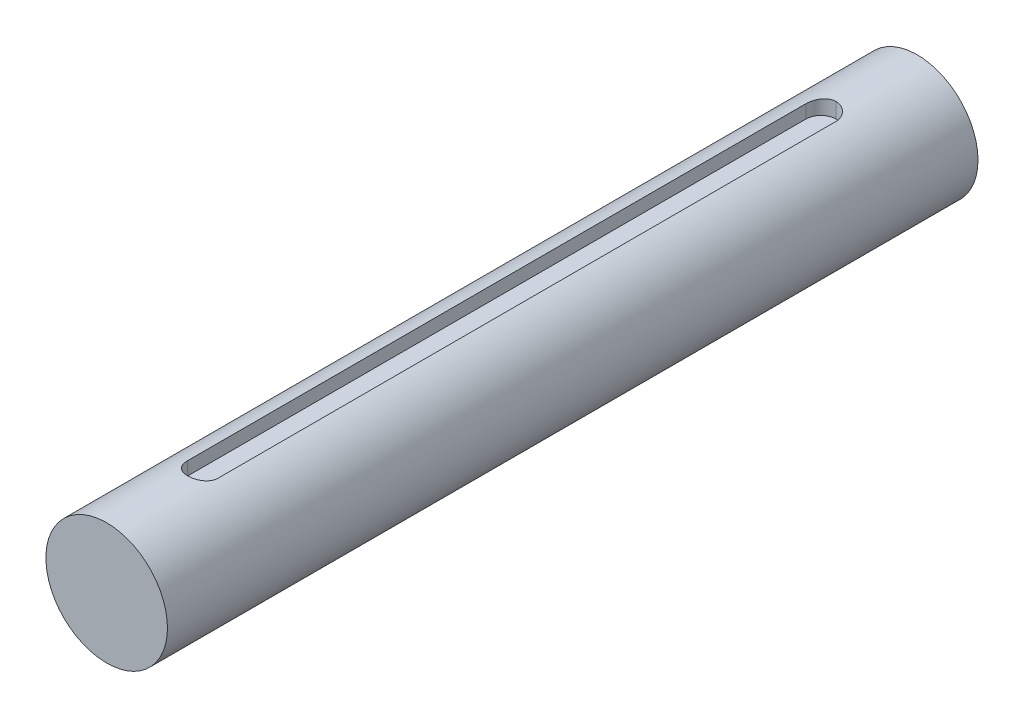
ISO-10303-21;
HEADER;
FILE_DESCRIPTION(('STEP AP214'),'2;1');
FILE_NAME('part.step','',(''),(''),'','','');
FILE_SCHEMA(('AUTOMOTIVE_DESIGN { 1 0 10303 214 1 1 1 1 }'));
ENDSEC;
DATA;
#1=APPLICATION_CONTEXT('core data for automotive mechanical design processes');
#2=APPLICATION_PROTOCOL_DEFINITION('international standard','automotive_design',2000,#1);
#3=PRODUCT_CONTEXT('',#1,'mechanical');
#4=PRODUCT('Part','Part','',(#3));
#5=PRODUCT_RELATED_PRODUCT_CATEGORY('part','',(#4));
#6=PRODUCT_DEFINITION_FORMATION('','',#4);
#7=PRODUCT_DEFINITION_CONTEXT('part definition',#1,'design');
#8=PRODUCT_DEFINITION('design','',#6,#7);
#9=PRODUCT_DEFINITION_SHAPE('','',#8);
#10=(LENGTH_UNIT() NAMED_UNIT(*) SI_UNIT(.MILLI.,.METRE.));
#11=(NAMED_UNIT(*) PLANE_ANGLE_UNIT() SI_UNIT($,.RADIAN.));
#12=(NAMED_UNIT(*) SI_UNIT($,.STERADIAN.) SOLID_ANGLE_UNIT());
#13=UNCERTAINTY_MEASURE_WITH_UNIT(LENGTH_MEASURE(1.E-05),#10,'distance_accuracy_value','');
#14=(GEOMETRIC_REPRESENTATION_CONTEXT(3) GLOBAL_UNCERTAINTY_ASSIGNED_CONTEXT((#13)) GLOBAL_UNIT_ASSIGNED_CONTEXT((#10,
#11,#12)) REPRESENTATION_CONTEXT('',''));
#15=CARTESIAN_POINT('',(0.,0.,0.));
#16=DIRECTION('',(0.,0.,1.));
#17=DIRECTION('',(1.,0.,0.));
#18=AXIS2_PLACEMENT_3D('',#15,#16,#17);
#19=CARTESIAN_POINT('',(2.38125,7.14375,-6.73519209080187));
#20=DIRECTION('',(1.,0.,0.));
#21=DIRECTION('',(0.,1.,0.));
#22=AXIS2_PLACEMENT_3D('',#19,#20,#21);
#23=PLANE('',#22);
#24=DIRECTION('',(0.,0.,1.));
#25=VECTOR('',#24,1.);
#26=CARTESIAN_POINT('',(2.38125,7.14375,-6.73519209080187));
#27=LINE('',#26,#25);
#28=CARTESIAN_POINT('',(2.38125,7.14375,15.08125));
#29=VERTEX_POINT('',#28);
#30=CARTESIAN_POINT('',(2.38125,7.14375,111.91875));
#31=VERTEX_POINT('',#30);
#32=EDGE_CURVE('E167',#29,#31,#27,.T.);
#33=ORIENTED_EDGE('',*,*,#32,.T.);
#34=DIRECTION('',(0.,1.,0.));
#35=VECTOR('',#34,1.);
#36=CARTESIAN_POINT('',(2.38125,9.22254159315641,111.91875));
#37=LINE('',#36,#35);
#38=CARTESIAN_POINT('',(2.38125,9.22254159315641,111.91875));
#39=VERTEX_POINT('',#38);
#40=EDGE_CURVE('E99',#31,#39,#37,.T.);
#41=ORIENTED_EDGE('',*,*,#40,.T.);
#42=DIRECTION('',(0.,0.,-1.));
#43=VECTOR('',#42,1.);
#44=CARTESIAN_POINT('',(2.38125,9.22254159315641,127.));
#45=LINE('',#44,#43);
#46=CARTESIAN_POINT('',(2.38125,9.22254159315641,15.08125));
#47=VERTEX_POINT('',#46);
#48=EDGE_CURVE('E88',#47,#39,#45,.F.);
#49=ORIENTED_EDGE('',*,*,#48,.F.);
#50=DIRECTION('',(0.,-1.,0.));
#51=VECTOR('',#50,1.);
#52=CARTESIAN_POINT('',(2.38125,7.14375,15.08125));
#53=LINE('',#52,#51);
#54=EDGE_CURVE('E96',#47,#29,#53,.T.);
#55=ORIENTED_EDGE('',*,*,#54,.T.);
#56=EDGE_LOOP('',(#33,#41,#49,#55));
#57=FACE_BOUND('',#56,.T.);
#58=ADVANCED_FACE('F35',(#57),#23,.F.);
#59=CARTESIAN_POINT('',(-2.38125,7.14375,-6.73519209080187));
#60=DIRECTION('',(-1.,0.,0.));
#61=DIRECTION('',(0.,0.,1.));
#62=AXIS2_PLACEMENT_3D('',#59,#60,#61);
#63=PLANE('',#62);
#64=DIRECTION('',(0.,0.,-1.));
#65=VECTOR('',#64,1.);
#66=CARTESIAN_POINT('',(-2.38125,9.22254159315641,127.));
#67=LINE('',#66,#65);
#68=CARTESIAN_POINT('',(-2.38125,9.22254159315641,111.91875));
#69=VERTEX_POINT('',#68);
#70=CARTESIAN_POINT('',(-2.38125,9.22254159315641,15.08125));
#71=VERTEX_POINT('',#70);
#72=EDGE_CURVE('E101',#69,#71,#67,.T.);
#73=ORIENTED_EDGE('',*,*,#72,.F.);
#74=DIRECTION('',(0.,-1.,0.));
#75=VECTOR('',#74,1.);
#76=CARTESIAN_POINT('',(-2.38125,7.14375,111.91875));
#77=LINE('',#76,#75);
#78=CARTESIAN_POINT('',(-2.38125,7.14375,111.91875));
#79=VERTEX_POINT('',#78);
#80=EDGE_CURVE('E122',#69,#79,#77,.T.);
#81=ORIENTED_EDGE('',*,*,#80,.T.);
#82=DIRECTION('',(0.,0.,1.));
#83=VECTOR('',#82,1.);
#84=CARTESIAN_POINT('',(-2.38125,7.14375,-6.73519209080187));
#85=LINE('',#84,#83);
#86=CARTESIAN_POINT('',(-2.38125,7.14375,15.08125));
#87=VERTEX_POINT('',#86);
#88=EDGE_CURVE('E163',#87,#79,#85,.T.);
#89=ORIENTED_EDGE('',*,*,#88,.F.);
#90=DIRECTION('',(0.,1.,0.));
#91=VECTOR('',#90,1.);
#92=CARTESIAN_POINT('',(-2.38125,7.14375,15.08125));
#93=LINE('',#92,#91);
#94=EDGE_CURVE('E119',#87,#71,#93,.T.);
#95=ORIENTED_EDGE('',*,*,#94,.T.);
#96=EDGE_LOOP('',(#73,#81,#89,#95));
#97=FACE_BOUND('',#96,.T.);
#98=ADVANCED_FACE('F177',(#97),#63,.F.);
#99=CARTESIAN_POINT('',(2.38125,7.14375,-6.73519209080187));
#100=DIRECTION('',(0.,-1.,0.));
#101=DIRECTION('',(0.,0.,-1.));
#102=AXIS2_PLACEMENT_3D('',#99,#100,#101);
#103=PLANE('',#102);
#104=CARTESIAN_POINT('',(0.,7.14375,111.91875));
#105=DIRECTION('',(0.,-1.,0.));
#106=DIRECTION('',(0.,0.,-1.));
#107=AXIS2_PLACEMENT_3D('',#104,#105,#106);
#108=CIRCLE('',#107,2.38125);
#109=CARTESIAN_POINT('',(0.,7.14375,114.3));
#110=VERTEX_POINT('',#109);
#111=EDGE_CURVE('E115',#79,#110,#108,.F.);
#112=ORIENTED_EDGE('',*,*,#111,.T.);
#113=CARTESIAN_POINT('',(0.,7.14375,111.91875));
#114=DIRECTION('',(0.,-1.,0.));
#115=DIRECTION('',(0.,0.,-1.));
#116=AXIS2_PLACEMENT_3D('',#113,#114,#115);
#117=CIRCLE('',#116,2.38125);
#118=EDGE_CURVE('E117',#110,#31,#117,.F.);
#119=ORIENTED_EDGE('',*,*,#118,.T.);
#120=ORIENTED_EDGE('',*,*,#32,.F.);
#121=CARTESIAN_POINT('',(0.,7.14375,15.08125));
#122=DIRECTION('',(0.,-1.,0.));
#123=DIRECTION('',(0.,0.,-1.));
#124=AXIS2_PLACEMENT_3D('',#121,#122,#123);
#125=CIRCLE('',#124,2.38125);
#126=CARTESIAN_POINT('',(0.,7.14375,12.7));
#127=VERTEX_POINT('',#126);
#128=EDGE_CURVE('E104',#29,#127,#125,.F.);
#129=ORIENTED_EDGE('',*,*,#128,.T.);
#130=CARTESIAN_POINT('',(0.,7.14375,15.08125));
#131=DIRECTION('',(0.,-1.,0.));
#132=DIRECTION('',(0.,0.,-1.));
#133=AXIS2_PLACEMENT_3D('',#130,#131,#132);
#134=CIRCLE('',#133,2.38125);
#135=EDGE_CURVE('E113',#127,#87,#134,.F.);
#136=ORIENTED_EDGE('',*,*,#135,.T.);
#137=ORIENTED_EDGE('',*,*,#88,.T.);
#138=EDGE_LOOP('',(#112,#119,#120,#129,#136,#137));
#139=FACE_BOUND('',#138,.T.);
#140=ADVANCED_FACE('F173',(#139),#103,.F.);
#141=CARTESIAN_POINT('',(0.,0.,127.));
#142=DIRECTION('',(0.,0.,-1.));
#143=DIRECTION('',(-1.,0.,0.));
#144=AXIS2_PLACEMENT_3D('',#141,#142,#143);
#145=CYLINDRICAL_SURFACE('',#144,9.525);
#146=CARTESIAN_POINT('',(0.,0.,127.));
#147=DIRECTION('',(0.,0.,1.));
#148=DIRECTION('',(1.,0.,0.));
#149=AXIS2_PLACEMENT_3D('',#146,#147,#148);
#150=CIRCLE('',#149,9.525);
#151=CARTESIAN_POINT('',(9.525,0.,127.));
#152=VERTEX_POINT('',#151);
#153=EDGE_CURVE('E105',#152,#152,#150,.T.);
#154=ORIENTED_EDGE('',*,*,#153,.F.);
#155=EDGE_LOOP('',(#154));
#156=FACE_BOUND('',#155,.T.);
#157=CARTESIAN_POINT('',(-2.38125,9.22254159315641,15.08125));
#158=CARTESIAN_POINT('',(-2.38125763074315,9.2225342345223,15.0153941373318));
#159=CARTESIAN_POINT('',(-2.37851815039527,9.22324681871764,14.9495427981308));
#160=CARTESIAN_POINT('',(-2.36760423136629,9.22605729674806,14.8183325820172));
#161=CARTESIAN_POINT('',(-2.35943070784727,9.22815495731823,14.7529736240556));
#162=CARTESIAN_POINT('',(-2.33773008394276,9.23367541031934,14.6233414348254));
#163=CARTESIAN_POINT('',(-2.32421393750892,9.23709549108838,14.559066260879));
#164=CARTESIAN_POINT('',(-2.29195356993802,9.24515268237875,14.4319373484491));
#165=CARTESIAN_POINT('',(-2.27320927722138,9.24978980956285,14.3690836294398));
#166=CARTESIAN_POINT('',(-2.20933915791582,9.26533281821018,14.1833205016729));
#167=CARTESIAN_POINT('',(-2.15655447290944,9.27787617792557,14.0630811637011));
#168=CARTESIAN_POINT('',(-2.0321922630698,9.30590440531809,13.8331869303088));
#169=CARTESIAN_POINT('',(-1.96060913855792,9.32139014909186,13.7235352020587));
#170=CARTESIAN_POINT('',(-1.799000281036,9.35393686274582,13.5154823899377));
#171=CARTESIAN_POINT('',(-1.70863959287883,9.37102281865316,13.417344917124));
#172=CARTESIAN_POINT('',(-1.51275234442794,9.40462987301472,13.2374435442794));
#173=CARTESIAN_POINT('',(-1.40722291298823,9.4211508637976,13.1556827510615));
#174=CARTESIAN_POINT('',(-1.18215868988682,9.45204719798276,13.0097542326671));
#175=CARTESIAN_POINT('',(-1.06244605103549,9.46638868248797,12.9458532677694));
#176=CARTESIAN_POINT('',(-0.813591534287606,9.49101048295816,12.8392172043035));
#177=CARTESIAN_POINT('',(-0.68445703328339,9.50129393659317,12.7964657464203));
#178=CARTESIAN_POINT('',(-0.462196310122587,9.51421049974997,12.7434371338685));
#179=CARTESIAN_POINT('',(-0.370534702416561,9.51823293284857,12.7271733394671));
#180=CARTESIAN_POINT('',(-0.18593156334214,9.5236379090544,12.7054480661359));
#181=CARTESIAN_POINT('',(-0.0929909916165587,9.52502233321601,12.6999788899133));
#182=CARTESIAN_POINT('',(0.,9.525,12.7));
#183=B_SPLINE_CURVE_WITH_KNOTS('',3,(#157,#158,#159,#160,#161,#162,#163,#164,#165,#166,#167,
#168,#169,#170,#171,#172,#173,#174,#175,#176,#177,#178,#179,#180,#181,#182),.UNSPECIFIED.,.F.,
.F.,(4,2,2,2,2,2,2,2,2,2,2,2,4),(0.,0.197498977317389,0.39496470171429,0.592027645889478,
0.789093288224276,1.18283976290481,1.57670366007859,1.97831196633882,2.37999638953134,
2.78739385686708,3.19447570431235,3.47338198780488,3.75208932030345),.UNSPECIFIED.);
#184=CARTESIAN_POINT('',(0.,9.525,12.7));
#185=VERTEX_POINT('',#184);
#186=EDGE_CURVE('E45',#71,#185,#183,.T.);
#187=ORIENTED_EDGE('',*,*,#186,.T.);
#188=CARTESIAN_POINT('',(0.,9.525,12.7));
#189=CARTESIAN_POINT('',(0.0658884199425099,9.52500650508056,12.6999924463347));
#190=CARTESIAN_POINT('',(0.131772499224708,9.52431647943195,12.7027345588879));
#191=CARTESIAN_POINT('',(0.263050053634154,9.52159161553763,12.7136595210218));
#192=CARTESIAN_POINT('',(0.328443603516503,9.51955698659647,12.7218415238158));
#193=CARTESIAN_POINT('',(0.458151537588408,9.51419640393246,12.7435663597325));
#194=CARTESIAN_POINT('',(0.522467788280683,9.5108729930561,12.7570986374533));
#195=CARTESIAN_POINT('',(0.649679412061081,9.50303168065627,12.7893990671768));
#196=CARTESIAN_POINT('',(0.712574770148888,9.49851376652885,12.8081672744271));
#197=CARTESIAN_POINT('',(0.898469050420059,9.48334152761523,12.8721241313657));
#198=CARTESIAN_POINT('',(1.0187965632787,9.47106339841349,12.9249853610688));
#199=CARTESIAN_POINT('',(1.24883708761313,9.44349019541688,13.049526590647));
#200=CARTESIAN_POINT('',(1.35854731920021,9.42819433466735,13.1212115009202));
#201=CARTESIAN_POINT('',(1.56653682572832,9.39589625275311,13.2829252502496));
#202=CARTESIAN_POINT('',(1.66456989745674,9.37886790715589,13.3732660573224));
#203=CARTESIAN_POINT('',(1.8442691545157,9.34519544835465,13.5690701642817));
#204=CARTESIAN_POINT('',(1.92593171538301,9.32855142095956,13.6745368042102));
#205=CARTESIAN_POINT('',(2.07175262604621,9.29726457998935,13.8995408540167));
#206=CARTESIAN_POINT('',(2.13562741704491,9.28265585815681,14.0192670257863));
#207=CARTESIAN_POINT('',(2.24221020364855,9.25749078996855,14.2681478929191));
#208=CARTESIAN_POINT('',(2.28493531333068,9.24693116869228,14.3972948676551));
#209=CARTESIAN_POINT('',(2.337893990042,9.23365452084293,14.6194840650112));
#210=CARTESIAN_POINT('',(2.35412654241721,9.22951409846927,14.7110556737323));
#211=CARTESIAN_POINT('',(2.37581166434526,9.22394586655219,14.8954849894754));
#212=CARTESIAN_POINT('',(2.38127128948668,9.22251628160498,14.988341814599));
#213=CARTESIAN_POINT('',(2.38125,9.22254159315641,15.08125));
#214=B_SPLINE_CURVE_WITH_KNOTS('',3,(#188,#189,#190,#191,#192,#193,#194,#195,#196,#197,#198,
#199,#200,#201,#202,#203,#204,#205,#206,#207,#208,#209,#210,#211,#212,#213),.UNSPECIFIED.,.F.,
.F.,(4,2,2,2,2,2,2,2,2,2,2,2,4),(0.,0.197597099193096,0.395163447134122,0.592341951689063,
0.789522536879094,1.18352169855585,1.57762374224359,1.97894489045528,2.38035479406148,
2.78783855486565,3.19499204331976,3.47363174513846,3.75208889485639),.UNSPECIFIED.);
#215=EDGE_CURVE('E12',#185,#47,#214,.T.);
#216=ORIENTED_EDGE('',*,*,#215,.T.);
#217=ORIENTED_EDGE('',*,*,#48,.T.);
#218=CARTESIAN_POINT('',(2.38125,9.22254159315641,111.91875));
#219=CARTESIAN_POINT('',(2.38125763074315,9.2225342345223,111.984605862668));
#220=CARTESIAN_POINT('',(2.37851815039527,9.22324681871764,112.050457201869));
#221=CARTESIAN_POINT('',(2.36760423136629,9.22605729674806,112.181667417983));
#222=CARTESIAN_POINT('',(2.35943070784727,9.22815495731823,112.247026375944));
#223=CARTESIAN_POINT('',(2.33773008394276,9.23367541031934,112.376658565175));
#224=CARTESIAN_POINT('',(2.32421393750892,9.23709549108838,112.440933739121));
#225=CARTESIAN_POINT('',(2.29195356993802,9.24515268237875,112.568062651551));
#226=CARTESIAN_POINT('',(2.27320927722138,9.24978980956285,112.63091637056));
#227=CARTESIAN_POINT('',(2.20933915791583,9.26533281821017,112.816679498327));
#228=CARTESIAN_POINT('',(2.15655447290944,9.27787617792557,112.936918836299));
#229=CARTESIAN_POINT('',(2.0321922630698,9.30590440531809,113.166813069691));
#230=CARTESIAN_POINT('',(1.96060913855793,9.32139014909185,113.276464797941));
#231=CARTESIAN_POINT('',(1.799000281036,9.35393686274582,113.484517610062));
#232=CARTESIAN_POINT('',(1.70863959287883,9.37102281865316,113.582655082876));
#233=CARTESIAN_POINT('',(1.51275234442795,9.40462987301472,113.762556455721));
#234=CARTESIAN_POINT('',(1.40722291298824,9.4211508637976,113.844317248939));
#235=CARTESIAN_POINT('',(1.18215868988682,9.45204719798276,113.990245767333));
#236=CARTESIAN_POINT('',(1.0624460510355,9.46638868248797,114.054146732231));
#237=CARTESIAN_POINT('',(0.813591534287614,9.49101048295816,114.160782795696));
#238=CARTESIAN_POINT('',(0.684457033283398,9.50129393659317,114.20353425358));
#239=CARTESIAN_POINT('',(0.462196310122593,9.51421049974997,114.256562866131));
#240=CARTESIAN_POINT('',(0.370534702416565,9.51823293284857,114.272826660533));
#241=CARTESIAN_POINT('',(0.185931563342142,9.5236379090544,114.294551933864));
#242=CARTESIAN_POINT('',(0.0929909916165586,9.52502233321602,114.300021110087));
#243=CARTESIAN_POINT('',(0.,9.525,114.3));
#244=B_SPLINE_CURVE_WITH_KNOTS('',3,(#218,#219,#220,#221,#222,#223,#224,#225,#226,#227,#228,
#229,#230,#231,#232,#233,#234,#235,#236,#237,#238,#239,#240,#241,#242,#243),.UNSPECIFIED.,.F.,
.F.,(4,2,2,2,2,2,2,2,2,2,2,2,4),(0.,0.197498977317401,0.394964701714275,0.592027645889465,
0.789093288224272,1.18283976290479,1.57670366007858,1.97831196633881,2.37999638953134,
2.78739385686706,3.19447570431235,3.47338198780488,3.75208932030344),.UNSPECIFIED.);
#245=CARTESIAN_POINT('',(0.,9.525,114.3));
#246=VERTEX_POINT('',#245);
#247=EDGE_CURVE('E58',#39,#246,#244,.T.);
#248=ORIENTED_EDGE('',*,*,#247,.T.);
#249=CARTESIAN_POINT('',(0.,9.525,114.3));
#250=CARTESIAN_POINT('',(-0.0658884199425079,9.52500650508056,114.300007553665));
#251=CARTESIAN_POINT('',(-0.131772499224705,9.52431647943195,114.297265441112));
#252=CARTESIAN_POINT('',(-0.263050053634152,9.52159161553763,114.286340478978));
#253=CARTESIAN_POINT('',(-0.328443603516501,9.51955698659647,114.278158476184));
#254=CARTESIAN_POINT('',(-0.458151537588405,9.51419640393246,114.256433640268));
#255=CARTESIAN_POINT('',(-0.522467788280678,9.5108729930561,114.242901362547));
#256=CARTESIAN_POINT('',(-0.649679412061076,9.50303168065627,114.210600932823));
#257=CARTESIAN_POINT('',(-0.712574770148886,9.49851376652885,114.191832725573));
#258=CARTESIAN_POINT('',(-0.898469050420059,9.48334152761523,114.127875868634));
#259=CARTESIAN_POINT('',(-1.01879656327869,9.47106339841349,114.075014638931));
#260=CARTESIAN_POINT('',(-1.24883708761312,9.44349019541688,113.950473409353));
#261=CARTESIAN_POINT('',(-1.35854731920021,9.42819433466735,113.87878849908));
#262=CARTESIAN_POINT('',(-1.56653682572831,9.39589625275311,113.71707474975));
#263=CARTESIAN_POINT('',(-1.66456989745673,9.37886790715589,113.626733942678));
#264=CARTESIAN_POINT('',(-1.84426915451569,9.34519544835465,113.430929835718));
#265=CARTESIAN_POINT('',(-1.92593171538301,9.32855142095957,113.32546319579));
#266=CARTESIAN_POINT('',(-2.07175262604621,9.29726457998935,113.100459145983));
#267=CARTESIAN_POINT('',(-2.13562741704491,9.28265585815681,112.980732974214));
#268=CARTESIAN_POINT('',(-2.24221020364855,9.25749078996855,112.731852107081));
#269=CARTESIAN_POINT('',(-2.28493531333068,9.24693116869228,112.602705132345));
#270=CARTESIAN_POINT('',(-2.337893990042,9.23365452084293,112.380515934989));
#271=CARTESIAN_POINT('',(-2.35412654241721,9.22951409846928,112.288944326268));
#272=CARTESIAN_POINT('',(-2.37581166434526,9.22394586655219,112.104515010525));
#273=CARTESIAN_POINT('',(-2.38127128948668,9.22251628160498,112.011658185401));
#274=CARTESIAN_POINT('',(-2.38125,9.22254159315641,111.91875));
#275=B_SPLINE_CURVE_WITH_KNOTS('',3,(#249,#250,#251,#252,#253,#254,#255,#256,#257,#258,#259,
#260,#261,#262,#263,#264,#265,#266,#267,#268,#269,#270,#271,#272,#273,#274),.UNSPECIFIED.,.F.,
.F.,(4,2,2,2,2,2,2,2,2,2,2,2,4),(0.,0.197597099193094,0.395163447134118,0.59234195168906,
0.789522536879092,1.18352169855585,1.57762374224359,1.97894489045526,2.38035479406147,
2.78783855486564,3.19499204331976,3.47363174513846,3.75208889485639),.UNSPECIFIED.);
#276=EDGE_CURVE('E131',#246,#69,#275,.T.);
#277=ORIENTED_EDGE('',*,*,#276,.T.);
#278=ORIENTED_EDGE('',*,*,#72,.T.);
#279=EDGE_LOOP('',(#187,#216,#217,#248,#277,#278));
#280=FACE_BOUND('',#279,.T.);
#281=CARTESIAN_POINT('',(0.,0.,0.));
#282=DIRECTION('',(0.,0.,1.));
#283=DIRECTION('',(1.,0.,0.));
#284=AXIS2_PLACEMENT_3D('',#281,#282,#283);
#285=CIRCLE('',#284,9.525);
#286=CARTESIAN_POINT('',(9.525,0.,0.));
#287=VERTEX_POINT('',#286);
#288=EDGE_CURVE('E100',#287,#287,#285,.T.);
#289=ORIENTED_EDGE('',*,*,#288,.T.);
#290=EDGE_LOOP('',(#289));
#291=FACE_BOUND('',#290,.T.);
#292=ADVANCED_FACE('F86',(#156,#280,#291),#145,.T.);
#293=CARTESIAN_POINT('',(0.,0.,127.));
#294=DIRECTION('',(0.,0.,1.));
#295=DIRECTION('',(1.,0.,0.));
#296=AXIS2_PLACEMENT_3D('',#293,#294,#295);
#297=PLANE('',#296);
#298=ORIENTED_EDGE('',*,*,#153,.T.);
#299=EDGE_LOOP('',(#298));
#300=FACE_BOUND('',#299,.T.);
#301=ADVANCED_FACE('F190',(#300),#297,.T.);
#302=CARTESIAN_POINT('',(0.,0.,0.));
#303=DIRECTION('',(0.,0.,1.));
#304=DIRECTION('',(1.,0.,0.));
#305=AXIS2_PLACEMENT_3D('',#302,#303,#304);
#306=PLANE('',#305);
#307=ORIENTED_EDGE('',*,*,#288,.F.);
#308=EDGE_LOOP('',(#307));
#309=FACE_BOUND('',#308,.T.);
#310=ADVANCED_FACE('F147',(#309),#306,.F.);
#311=CARTESIAN_POINT('',(0.,7.14375,111.91875));
#312=DIRECTION('',(0.,1.,0.));
#313=DIRECTION('',(0.,0.,1.));
#314=AXIS2_PLACEMENT_3D('',#311,#312,#313);
#315=CYLINDRICAL_SURFACE('',#314,2.38125);
#316=DIRECTION('',(0.,-1.,0.));
#317=VECTOR('',#316,1.);
#318=CARTESIAN_POINT('',(0.,9.22254159315641,114.3));
#319=LINE('',#318,#317);
#320=EDGE_CURVE('E161',#110,#246,#319,.F.);
#321=ORIENTED_EDGE('',*,*,#320,.F.);
#322=ORIENTED_EDGE('',*,*,#111,.F.);
#323=ORIENTED_EDGE('',*,*,#80,.F.);
#324=ORIENTED_EDGE('',*,*,#276,.F.);
#325=EDGE_LOOP('',(#321,#322,#323,#324));
#326=FACE_BOUND('',#325,.T.);
#327=ADVANCED_FACE('F143',(#326),#315,.F.);
#328=CARTESIAN_POINT('',(0.,7.14375,111.91875));
#329=DIRECTION('',(0.,-1.,0.));
#330=DIRECTION('',(1.,0.,0.));
#331=AXIS2_PLACEMENT_3D('',#328,#329,#330);
#332=CYLINDRICAL_SURFACE('',#331,2.38125);
#333=ORIENTED_EDGE('',*,*,#118,.F.);
#334=ORIENTED_EDGE('',*,*,#320,.T.);
#335=ORIENTED_EDGE('',*,*,#247,.F.);
#336=ORIENTED_EDGE('',*,*,#40,.F.);
#337=EDGE_LOOP('',(#333,#334,#335,#336));
#338=FACE_BOUND('',#337,.T.);
#339=ADVANCED_FACE('F140',(#338),#332,.F.);
#340=CARTESIAN_POINT('',(0.,7.14375,15.08125));
#341=DIRECTION('',(0.,-1.,0.));
#342=DIRECTION('',(1.,0.,0.));
#343=AXIS2_PLACEMENT_3D('',#340,#341,#342);
#344=CYLINDRICAL_SURFACE('',#343,2.38125);
#345=DIRECTION('',(0.,-1.,0.));
#346=VECTOR('',#345,1.);
#347=CARTESIAN_POINT('',(0.,0.,12.7));
#348=LINE('',#347,#346);
#349=EDGE_CURVE('E40',#127,#185,#348,.F.);
#350=ORIENTED_EDGE('',*,*,#349,.F.);
#351=ORIENTED_EDGE('',*,*,#128,.F.);
#352=ORIENTED_EDGE('',*,*,#54,.F.);
#353=ORIENTED_EDGE('',*,*,#215,.F.);
#354=EDGE_LOOP('',(#350,#351,#352,#353));
#355=FACE_BOUND('',#354,.T.);
#356=ADVANCED_FACE('F37',(#355),#344,.F.);
#357=CARTESIAN_POINT('',(0.,7.14375,15.08125));
#358=DIRECTION('',(0.,1.,0.));
#359=DIRECTION('',(0.,0.,1.));
#360=AXIS2_PLACEMENT_3D('',#357,#358,#359);
#361=CYLINDRICAL_SURFACE('',#360,2.38125);
#362=ORIENTED_EDGE('',*,*,#135,.F.);
#363=ORIENTED_EDGE('',*,*,#349,.T.);
#364=ORIENTED_EDGE('',*,*,#186,.F.);
#365=ORIENTED_EDGE('',*,*,#94,.F.);
#366=EDGE_LOOP('',(#362,#363,#364,#365));
#367=FACE_BOUND('',#366,.T.);
#368=ADVANCED_FACE('F149',(#367),#361,.F.);
#369=CLOSED_SHELL('',(#58,#98,#140,#292,#301,#310,#327,#339,#356,#368));
#370=MANIFOLD_SOLID_BREP('B2',#369);
#371=ADVANCED_BREP_SHAPE_REPRESENTATION('',(#18,#370),#14);
#372=SHAPE_DEFINITION_REPRESENTATION(#9,#371);
ENDSEC;
END-ISO-10303-21;
